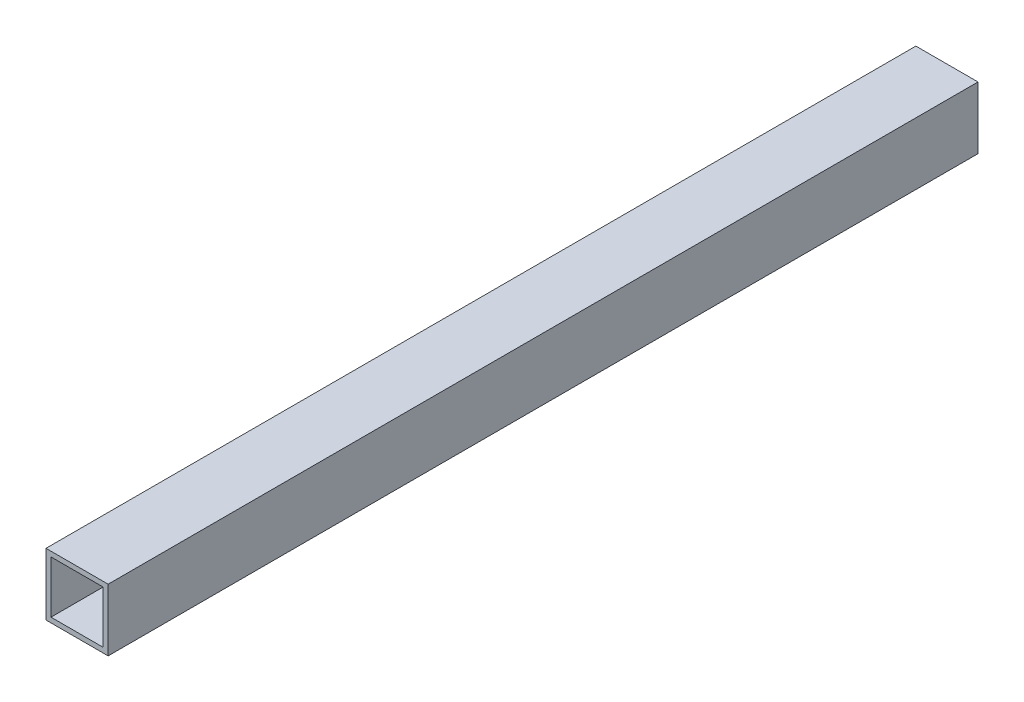
ISO-10303-21;
HEADER;
FILE_DESCRIPTION(('STEP AP214'),'2;1');
FILE_NAME('part.step','',(''),(''),'','','');
FILE_SCHEMA(('AUTOMOTIVE_DESIGN { 1 0 10303 214 1 1 1 1 }'));
ENDSEC;
DATA;
#1=APPLICATION_CONTEXT('core data for automotive mechanical design processes');
#2=APPLICATION_PROTOCOL_DEFINITION('international standard','automotive_design',2000,#1);
#3=PRODUCT_CONTEXT('',#1,'mechanical');
#4=PRODUCT('Part','Part','',(#3));
#5=PRODUCT_RELATED_PRODUCT_CATEGORY('part','',(#4));
#6=PRODUCT_DEFINITION_FORMATION('','',#4);
#7=PRODUCT_DEFINITION_CONTEXT('part definition',#1,'design');
#8=PRODUCT_DEFINITION('design','',#6,#7);
#9=PRODUCT_DEFINITION_SHAPE('','',#8);
#10=(LENGTH_UNIT() NAMED_UNIT(*) SI_UNIT(.MILLI.,.METRE.));
#11=(NAMED_UNIT(*) PLANE_ANGLE_UNIT() SI_UNIT($,.RADIAN.));
#12=(NAMED_UNIT(*) SI_UNIT($,.STERADIAN.) SOLID_ANGLE_UNIT());
#13=UNCERTAINTY_MEASURE_WITH_UNIT(LENGTH_MEASURE(1.E-05),#10,'distance_accuracy_value','');
#14=(GEOMETRIC_REPRESENTATION_CONTEXT(3) GLOBAL_UNCERTAINTY_ASSIGNED_CONTEXT((#13)) GLOBAL_UNIT_ASSIGNED_CONTEXT((#10,
#11,#12)) REPRESENTATION_CONTEXT('',''));
#15=CARTESIAN_POINT('',(0.,0.,0.));
#16=DIRECTION('',(0.,0.,1.));
#17=DIRECTION('',(1.,0.,0.));
#18=AXIS2_PLACEMENT_3D('',#15,#16,#17);
#19=CARTESIAN_POINT('',(-10.,230.,-2300.));
#20=DIRECTION('',(1.,0.,0.));
#21=DIRECTION('',(0.,1.,0.));
#22=AXIS2_PLACEMENT_3D('',#19,#20,#21);
#23=PLANE('',#22);
#24=DIRECTION('',(0.,1.,0.));
#25=VECTOR('',#24,1.);
#26=CARTESIAN_POINT('',(-10.,230.,-2290.));
#27=LINE('',#26,#25);
#28=CARTESIAN_POINT('',(-10.,210.,-2290.));
#29=VERTEX_POINT('',#28);
#30=CARTESIAN_POINT('',(-10.,230.,-2290.));
#31=VERTEX_POINT('',#30);
#32=EDGE_CURVE('E109',#29,#31,#27,.T.);
#33=ORIENTED_EDGE('',*,*,#32,.F.);
#34=DIRECTION('',(0.,0.,1.));
#35=VECTOR('',#34,1.);
#36=CARTESIAN_POINT('',(-10.,210.,-2300.));
#37=LINE('',#36,#35);
#38=CARTESIAN_POINT('',(-10.,210.,-2010.));
#39=VERTEX_POINT('',#38);
#40=EDGE_CURVE('E128',#29,#39,#37,.T.);
#41=ORIENTED_EDGE('',*,*,#40,.T.);
#42=DIRECTION('',(0.,-1.,0.));
#43=VECTOR('',#42,1.);
#44=CARTESIAN_POINT('',(-10.,230.,-2010.));
#45=LINE('',#44,#43);
#46=CARTESIAN_POINT('',(-10.,230.,-2010.));
#47=VERTEX_POINT('',#46);
#48=EDGE_CURVE('E50',#47,#39,#45,.T.);
#49=ORIENTED_EDGE('',*,*,#48,.F.);
#50=DIRECTION('',(0.,0.,1.));
#51=VECTOR('',#50,1.);
#52=CARTESIAN_POINT('',(-10.,230.,-2300.));
#53=LINE('',#52,#51);
#54=EDGE_CURVE('E45',#31,#47,#53,.T.);
#55=ORIENTED_EDGE('',*,*,#54,.F.);
#56=EDGE_LOOP('',(#33,#41,#49,#55));
#57=FACE_BOUND('',#56,.T.);
#58=ADVANCED_FACE('F41',(#57),#23,.F.);
#59=CARTESIAN_POINT('',(10.,230.,-2300.));
#60=DIRECTION('',(-1.,0.,0.));
#61=DIRECTION('',(0.,-1.,0.));
#62=AXIS2_PLACEMENT_3D('',#59,#60,#61);
#63=PLANE('',#62);
#64=DIRECTION('',(0.,-1.,0.));
#65=VECTOR('',#64,1.);
#66=CARTESIAN_POINT('',(10.,230.,-2290.));
#67=LINE('',#66,#65);
#68=CARTESIAN_POINT('',(10.,230.,-2290.));
#69=VERTEX_POINT('',#68);
#70=CARTESIAN_POINT('',(10.,210.,-2290.));
#71=VERTEX_POINT('',#70);
#72=EDGE_CURVE('E66',#69,#71,#67,.T.);
#73=ORIENTED_EDGE('',*,*,#72,.F.);
#74=DIRECTION('',(0.,0.,1.));
#75=VECTOR('',#74,1.);
#76=CARTESIAN_POINT('',(10.,230.,-2300.));
#77=LINE('',#76,#75);
#78=CARTESIAN_POINT('',(10.,230.,-2010.));
#79=VERTEX_POINT('',#78);
#80=EDGE_CURVE('E119',#69,#79,#77,.T.);
#81=ORIENTED_EDGE('',*,*,#80,.T.);
#82=DIRECTION('',(0.,1.,0.));
#83=VECTOR('',#82,1.);
#84=CARTESIAN_POINT('',(10.,230.,-2010.));
#85=LINE('',#84,#83);
#86=CARTESIAN_POINT('',(10.,210.,-2010.));
#87=VERTEX_POINT('',#86);
#88=EDGE_CURVE('E143',#87,#79,#85,.T.);
#89=ORIENTED_EDGE('',*,*,#88,.F.);
#90=DIRECTION('',(0.,0.,1.));
#91=VECTOR('',#90,1.);
#92=CARTESIAN_POINT('',(10.,210.,-2300.));
#93=LINE('',#92,#91);
#94=EDGE_CURVE('E121',#71,#87,#93,.T.);
#95=ORIENTED_EDGE('',*,*,#94,.F.);
#96=EDGE_LOOP('',(#73,#81,#89,#95));
#97=FACE_BOUND('',#96,.T.);
#98=ADVANCED_FACE('F117',(#97),#63,.F.);
#99=CARTESIAN_POINT('',(10.,230.,-2300.));
#100=DIRECTION('',(0.,-1.,0.));
#101=DIRECTION('',(1.,0.,0.));
#102=AXIS2_PLACEMENT_3D('',#99,#100,#101);
#103=PLANE('',#102);
#104=DIRECTION('',(-1.,0.,0.));
#105=VECTOR('',#104,1.);
#106=CARTESIAN_POINT('',(250.,230.,-2290.));
#107=LINE('',#106,#105);
#108=EDGE_CURVE('E106',#69,#31,#107,.T.);
#109=ORIENTED_EDGE('',*,*,#108,.T.);
#110=ORIENTED_EDGE('',*,*,#54,.T.);
#111=DIRECTION('',(1.,0.,0.));
#112=VECTOR('',#111,1.);
#113=CARTESIAN_POINT('',(-250.,230.,-2010.));
#114=LINE('',#113,#112);
#115=EDGE_CURVE('E126',#47,#79,#114,.T.);
#116=ORIENTED_EDGE('',*,*,#115,.T.);
#117=ORIENTED_EDGE('',*,*,#80,.F.);
#118=EDGE_LOOP('',(#109,#110,#116,#117));
#119=FACE_BOUND('',#118,.T.);
#120=ADVANCED_FACE('F124',(#119),#103,.F.);
#121=CARTESIAN_POINT('',(8.40000000000002,228.4,-2300.));
#122=DIRECTION('',(0.,-1.,0.));
#123=DIRECTION('',(1.,0.,0.));
#124=AXIS2_PLACEMENT_3D('',#121,#122,#123);
#125=PLANE('',#124);
#126=DIRECTION('',(0.,0.,1.));
#127=VECTOR('',#126,1.);
#128=CARTESIAN_POINT('',(-8.39999999999999,228.4,-2300.));
#129=LINE('',#128,#127);
#130=CARTESIAN_POINT('',(-8.39999999999999,228.4,-2290.));
#131=VERTEX_POINT('',#130);
#132=CARTESIAN_POINT('',(-8.39999999999999,228.4,-2010.));
#133=VERTEX_POINT('',#132);
#134=EDGE_CURVE('E131',#131,#133,#129,.T.);
#135=ORIENTED_EDGE('',*,*,#134,.F.);
#136=DIRECTION('',(1.,0.,0.));
#137=VECTOR('',#136,1.);
#138=CARTESIAN_POINT('',(8.40000000000002,228.4,-2290.));
#139=LINE('',#138,#137);
#140=CARTESIAN_POINT('',(8.40000000000002,228.4,-2290.));
#141=VERTEX_POINT('',#140);
#142=EDGE_CURVE('E58',#131,#141,#139,.T.);
#143=ORIENTED_EDGE('',*,*,#142,.T.);
#144=DIRECTION('',(0.,0.,1.));
#145=VECTOR('',#144,1.);
#146=CARTESIAN_POINT('',(8.40000000000002,228.4,-2300.));
#147=LINE('',#146,#145);
#148=CARTESIAN_POINT('',(8.40000000000002,228.4,-2010.));
#149=VERTEX_POINT('',#148);
#150=EDGE_CURVE('E133',#141,#149,#147,.T.);
#151=ORIENTED_EDGE('',*,*,#150,.T.);
#152=DIRECTION('',(-1.,0.,0.));
#153=VECTOR('',#152,1.);
#154=CARTESIAN_POINT('',(8.40000000000002,228.4,-2010.));
#155=LINE('',#154,#153);
#156=EDGE_CURVE('E138',#149,#133,#155,.T.);
#157=ORIENTED_EDGE('',*,*,#156,.T.);
#158=EDGE_LOOP('',(#135,#143,#151,#157));
#159=FACE_BOUND('',#158,.T.);
#160=ADVANCED_FACE('F176',(#159),#125,.T.);
#161=CARTESIAN_POINT('',(8.40000000000002,228.4,-2300.));
#162=DIRECTION('',(-1.,0.,0.));
#163=DIRECTION('',(0.,-1.,0.));
#164=AXIS2_PLACEMENT_3D('',#161,#162,#163);
#165=PLANE('',#164);
#166=ORIENTED_EDGE('',*,*,#150,.F.);
#167=DIRECTION('',(0.,-1.,0.));
#168=VECTOR('',#167,1.);
#169=CARTESIAN_POINT('',(8.40000000000002,228.4,-2290.));
#170=LINE('',#169,#168);
#171=CARTESIAN_POINT('',(8.40000000000001,211.6,-2290.));
#172=VERTEX_POINT('',#171);
#173=EDGE_CURVE('E166',#141,#172,#170,.T.);
#174=ORIENTED_EDGE('',*,*,#173,.T.);
#175=DIRECTION('',(0.,0.,1.));
#176=VECTOR('',#175,1.);
#177=CARTESIAN_POINT('',(8.40000000000002,211.6,-2300.));
#178=LINE('',#177,#176);
#179=CARTESIAN_POINT('',(8.40000000000001,211.6,-2010.));
#180=VERTEX_POINT('',#179);
#181=EDGE_CURVE('E146',#172,#180,#178,.T.);
#182=ORIENTED_EDGE('',*,*,#181,.T.);
#183=DIRECTION('',(0.,1.,0.));
#184=VECTOR('',#183,1.);
#185=CARTESIAN_POINT('',(8.40000000000002,228.4,-2010.));
#186=LINE('',#185,#184);
#187=EDGE_CURVE('E148',#180,#149,#186,.T.);
#188=ORIENTED_EDGE('',*,*,#187,.T.);
#189=EDGE_LOOP('',(#166,#174,#182,#188));
#190=FACE_BOUND('',#189,.T.);
#191=ADVANCED_FACE('F183',(#190),#165,.T.);
#192=CARTESIAN_POINT('',(8.40000000000002,211.6,-2300.));
#193=DIRECTION('',(0.,1.,0.));
#194=DIRECTION('',(-1.,0.,0.));
#195=AXIS2_PLACEMENT_3D('',#192,#193,#194);
#196=PLANE('',#195);
#197=ORIENTED_EDGE('',*,*,#181,.F.);
#198=DIRECTION('',(-1.,0.,0.));
#199=VECTOR('',#198,1.);
#200=CARTESIAN_POINT('',(8.40000000000002,211.6,-2290.));
#201=LINE('',#200,#199);
#202=CARTESIAN_POINT('',(-8.4,211.6,-2290.));
#203=VERTEX_POINT('',#202);
#204=EDGE_CURVE('E169',#172,#203,#201,.T.);
#205=ORIENTED_EDGE('',*,*,#204,.T.);
#206=DIRECTION('',(0.,0.,1.));
#207=VECTOR('',#206,1.);
#208=CARTESIAN_POINT('',(-8.39999999999999,211.6,-2300.));
#209=LINE('',#208,#207);
#210=CARTESIAN_POINT('',(-8.39999999999999,211.6,-2010.));
#211=VERTEX_POINT('',#210);
#212=EDGE_CURVE('E150',#203,#211,#209,.T.);
#213=ORIENTED_EDGE('',*,*,#212,.T.);
#214=DIRECTION('',(1.,0.,0.));
#215=VECTOR('',#214,1.);
#216=CARTESIAN_POINT('',(8.40000000000002,211.6,-2010.));
#217=LINE('',#216,#215);
#218=EDGE_CURVE('E149',#211,#180,#217,.T.);
#219=ORIENTED_EDGE('',*,*,#218,.T.);
#220=EDGE_LOOP('',(#197,#205,#213,#219));
#221=FACE_BOUND('',#220,.T.);
#222=ADVANCED_FACE('F186',(#221),#196,.T.);
#223=CARTESIAN_POINT('',(-8.39999999999999,228.4,-2300.));
#224=DIRECTION('',(1.,0.,0.));
#225=DIRECTION('',(0.,1.,0.));
#226=AXIS2_PLACEMENT_3D('',#223,#224,#225);
#227=PLANE('',#226);
#228=ORIENTED_EDGE('',*,*,#212,.F.);
#229=DIRECTION('',(0.,1.,0.));
#230=VECTOR('',#229,1.);
#231=CARTESIAN_POINT('',(-8.39999999999999,228.4,-2290.));
#232=LINE('',#231,#230);
#233=EDGE_CURVE('E113',#203,#131,#232,.T.);
#234=ORIENTED_EDGE('',*,*,#233,.T.);
#235=ORIENTED_EDGE('',*,*,#134,.T.);
#236=DIRECTION('',(0.,-1.,0.));
#237=VECTOR('',#236,1.);
#238=CARTESIAN_POINT('',(-8.39999999999999,228.4,-2010.));
#239=LINE('',#238,#237);
#240=EDGE_CURVE('E152',#133,#211,#239,.T.);
#241=ORIENTED_EDGE('',*,*,#240,.T.);
#242=EDGE_LOOP('',(#228,#234,#235,#241));
#243=FACE_BOUND('',#242,.T.);
#244=ADVANCED_FACE('F43',(#243),#227,.T.);
#245=CARTESIAN_POINT('',(10.,210.,-2300.));
#246=DIRECTION('',(0.,1.,0.));
#247=DIRECTION('',(-1.,0.,0.));
#248=AXIS2_PLACEMENT_3D('',#245,#246,#247);
#249=PLANE('',#248);
#250=DIRECTION('',(-1.,0.,0.));
#251=VECTOR('',#250,1.);
#252=CARTESIAN_POINT('',(10.,210.,-2290.));
#253=LINE('',#252,#251);
#254=EDGE_CURVE('E162',#71,#29,#253,.T.);
#255=ORIENTED_EDGE('',*,*,#254,.F.);
#256=ORIENTED_EDGE('',*,*,#94,.T.);
#257=DIRECTION('',(1.,0.,0.));
#258=VECTOR('',#257,1.);
#259=CARTESIAN_POINT('',(-250.,210.,-2010.));
#260=LINE('',#259,#258);
#261=EDGE_CURVE('E11',#39,#87,#260,.T.);
#262=ORIENTED_EDGE('',*,*,#261,.F.);
#263=ORIENTED_EDGE('',*,*,#40,.F.);
#264=EDGE_LOOP('',(#255,#256,#262,#263));
#265=FACE_BOUND('',#264,.T.);
#266=ADVANCED_FACE('F193',(#265),#249,.F.);
#267=CARTESIAN_POINT('',(-250.,210.,-2010.));
#268=DIRECTION('',(0.,0.,1.));
#269=DIRECTION('',(1.,0.,0.));
#270=AXIS2_PLACEMENT_3D('',#267,#268,#269);
#271=PLANE('',#270);
#272=ORIENTED_EDGE('',*,*,#156,.F.);
#273=ORIENTED_EDGE('',*,*,#187,.F.);
#274=ORIENTED_EDGE('',*,*,#218,.F.);
#275=ORIENTED_EDGE('',*,*,#240,.F.);
#276=EDGE_LOOP('',(#272,#273,#274,#275));
#277=FACE_BOUND('',#276,.T.);
#278=ORIENTED_EDGE('',*,*,#88,.T.);
#279=ORIENTED_EDGE('',*,*,#115,.F.);
#280=ORIENTED_EDGE('',*,*,#48,.T.);
#281=ORIENTED_EDGE('',*,*,#261,.T.);
#282=EDGE_LOOP('',(#278,#279,#280,#281));
#283=FACE_BOUND('',#282,.T.);
#284=ADVANCED_FACE('F179',(#277,#283),#271,.T.);
#285=CARTESIAN_POINT('',(250.,210.,-2290.));
#286=DIRECTION('',(0.,0.,-1.));
#287=DIRECTION('',(-1.,0.,0.));
#288=AXIS2_PLACEMENT_3D('',#285,#286,#287);
#289=PLANE('',#288);
#290=ORIENTED_EDGE('',*,*,#233,.F.);
#291=ORIENTED_EDGE('',*,*,#204,.F.);
#292=ORIENTED_EDGE('',*,*,#173,.F.);
#293=ORIENTED_EDGE('',*,*,#142,.F.);
#294=EDGE_LOOP('',(#290,#291,#292,#293));
#295=FACE_BOUND('',#294,.T.);
#296=ORIENTED_EDGE('',*,*,#32,.T.);
#297=ORIENTED_EDGE('',*,*,#108,.F.);
#298=ORIENTED_EDGE('',*,*,#72,.T.);
#299=ORIENTED_EDGE('',*,*,#254,.T.);
#300=EDGE_LOOP('',(#296,#297,#298,#299));
#301=FACE_BOUND('',#300,.T.);
#302=ADVANCED_FACE('F107',(#295,#301),#289,.T.);
#303=CLOSED_SHELL('',(#58,#98,#120,#160,#191,#222,#244,#266,#284,#302));
#304=MANIFOLD_SOLID_BREP('B2',#303);
#305=ADVANCED_BREP_SHAPE_REPRESENTATION('',(#18,#304),#14);
#306=SHAPE_DEFINITION_REPRESENTATION(#9,#305);
ENDSEC;
END-ISO-10303-21;
